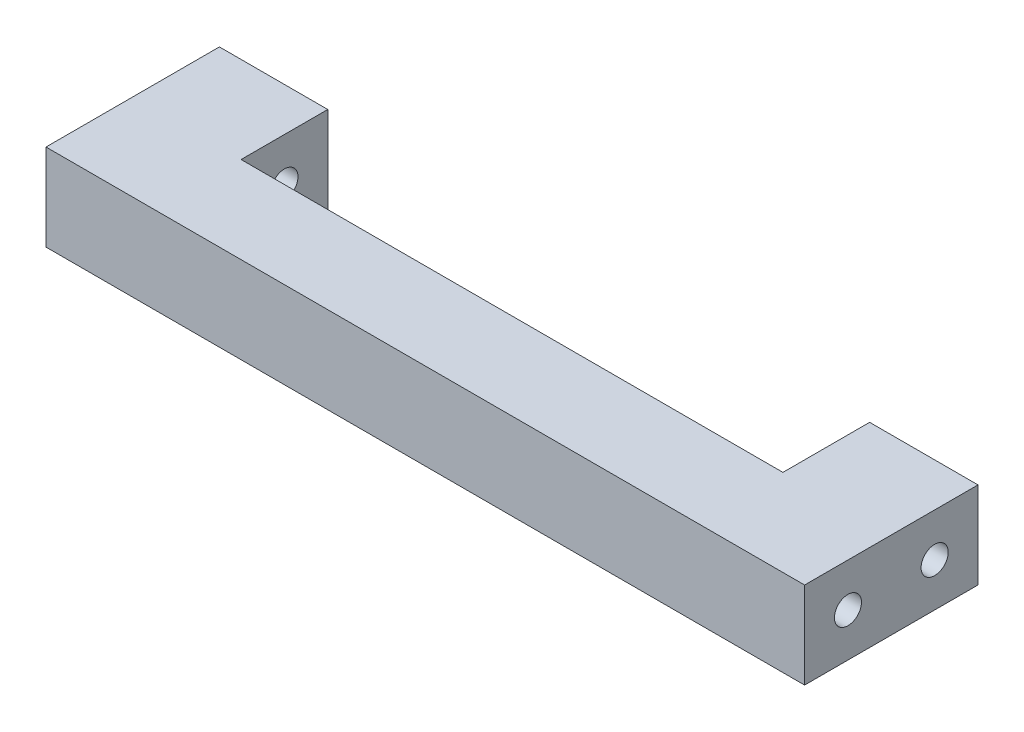
ISO-10303-21;
HEADER;
FILE_DESCRIPTION(('STEP AP214'),'2;1');
FILE_NAME('part.step','',(''),(''),'','','');
FILE_SCHEMA(('AUTOMOTIVE_DESIGN { 1 0 10303 214 1 1 1 1 }'));
ENDSEC;
DATA;
#1=APPLICATION_CONTEXT('core data for automotive mechanical design processes');
#2=APPLICATION_PROTOCOL_DEFINITION('international standard','automotive_design',2000,#1);
#3=PRODUCT_CONTEXT('',#1,'mechanical');
#4=PRODUCT('Part','Part','',(#3));
#5=PRODUCT_RELATED_PRODUCT_CATEGORY('part','',(#4));
#6=PRODUCT_DEFINITION_FORMATION('','',#4);
#7=PRODUCT_DEFINITION_CONTEXT('part definition',#1,'design');
#8=PRODUCT_DEFINITION('design','',#6,#7);
#9=PRODUCT_DEFINITION_SHAPE('','',#8);
#10=(LENGTH_UNIT() NAMED_UNIT(*) SI_UNIT(.MILLI.,.METRE.));
#11=(NAMED_UNIT(*) PLANE_ANGLE_UNIT() SI_UNIT($,.RADIAN.));
#12=(NAMED_UNIT(*) SI_UNIT($,.STERADIAN.) SOLID_ANGLE_UNIT());
#13=UNCERTAINTY_MEASURE_WITH_UNIT(LENGTH_MEASURE(1.E-05),#10,'distance_accuracy_value','');
#14=(GEOMETRIC_REPRESENTATION_CONTEXT(3) GLOBAL_UNCERTAINTY_ASSIGNED_CONTEXT((#13)) GLOBAL_UNIT_ASSIGNED_CONTEXT((#10,
#11,#12)) REPRESENTATION_CONTEXT('',''));
#15=CARTESIAN_POINT('',(0.,0.,0.));
#16=DIRECTION('',(0.,0.,1.));
#17=DIRECTION('',(1.,0.,0.));
#18=AXIS2_PLACEMENT_3D('',#15,#16,#17);
#19=CARTESIAN_POINT('',(35.,8.,-8.00000000000001));
#20=DIRECTION('',(0.,0.,1.));
#21=DIRECTION('',(1.,0.,0.));
#22=AXIS2_PLACEMENT_3D('',#19,#20,#21);
#23=PLANE('',#22);
#24=DIRECTION('',(-1.,0.,0.));
#25=VECTOR('',#24,1.);
#26=CARTESIAN_POINT('',(35.,8.,-8.00000000000001));
#27=LINE('',#26,#25);
#28=CARTESIAN_POINT('',(-25.,8.,-8.));
#29=VERTEX_POINT('',#28);
#30=CARTESIAN_POINT('',(-35.,8.,-8.));
#31=VERTEX_POINT('',#30);
#32=EDGE_CURVE('E65',#29,#31,#27,.T.);
#33=ORIENTED_EDGE('',*,*,#32,.F.);
#34=DIRECTION('',(0.,1.,0.));
#35=VECTOR('',#34,1.);
#36=CARTESIAN_POINT('',(-25.,0.,-8.));
#37=LINE('',#36,#35);
#38=CARTESIAN_POINT('',(-25.,0.,-8.));
#39=VERTEX_POINT('',#38);
#40=EDGE_CURVE('E152',#39,#29,#37,.T.);
#41=ORIENTED_EDGE('',*,*,#40,.F.);
#42=DIRECTION('',(-1.,0.,0.));
#43=VECTOR('',#42,1.);
#44=CARTESIAN_POINT('',(35.,0.,-8.00000000000001));
#45=LINE('',#44,#43);
#46=CARTESIAN_POINT('',(-35.,0.,-8.));
#47=VERTEX_POINT('',#46);
#48=EDGE_CURVE('E87',#39,#47,#45,.T.);
#49=ORIENTED_EDGE('',*,*,#48,.T.);
#50=DIRECTION('',(0.,-1.,0.));
#51=VECTOR('',#50,1.);
#52=CARTESIAN_POINT('',(-35.,8.,-8.));
#53=LINE('',#52,#51);
#54=EDGE_CURVE('E175',#31,#47,#53,.T.);
#55=ORIENTED_EDGE('',*,*,#54,.F.);
#56=EDGE_LOOP('',(#33,#41,#49,#55));
#57=FACE_BOUND('',#56,.T.);
#58=ADVANCED_FACE('F38',(#57),#23,.F.);
#59=CARTESIAN_POINT('',(-35.,8.,8.00000000000001));
#60=DIRECTION('',(1.,0.,0.));
#61=DIRECTION('',(0.,0.,-1.));
#62=AXIS2_PLACEMENT_3D('',#59,#60,#61);
#63=PLANE('',#62);
#64=CARTESIAN_POINT('',(-35.,4.,4.));
#65=DIRECTION('',(1.,0.,0.));
#66=DIRECTION('',(0.,0.,-1.));
#67=AXIS2_PLACEMENT_3D('',#64,#65,#66);
#68=CIRCLE('',#67,1.25);
#69=CARTESIAN_POINT('',(-35.,4.,2.75));
#70=VERTEX_POINT('',#69);
#71=EDGE_CURVE('E214',#70,#70,#68,.T.);
#72=ORIENTED_EDGE('',*,*,#71,.T.);
#73=EDGE_LOOP('',(#72));
#74=FACE_BOUND('',#73,.T.);
#75=CARTESIAN_POINT('',(-35.,4.,-4.));
#76=DIRECTION('',(1.,0.,0.));
#77=DIRECTION('',(0.,0.,-1.));
#78=AXIS2_PLACEMENT_3D('',#75,#76,#77);
#79=CIRCLE('',#78,1.25);
#80=CARTESIAN_POINT('',(-35.,4.,-5.25));
#81=VERTEX_POINT('',#80);
#82=EDGE_CURVE('E210',#81,#81,#79,.T.);
#83=ORIENTED_EDGE('',*,*,#82,.T.);
#84=EDGE_LOOP('',(#83));
#85=FACE_BOUND('',#84,.T.);
#86=DIRECTION('',(0.,0.,1.));
#87=VECTOR('',#86,1.);
#88=CARTESIAN_POINT('',(-35.,0.,8.00000000000001));
#89=LINE('',#88,#87);
#90=CARTESIAN_POINT('',(-35.,0.,8.00000000000001));
#91=VERTEX_POINT('',#90);
#92=EDGE_CURVE('E155',#47,#91,#89,.T.);
#93=ORIENTED_EDGE('',*,*,#92,.T.);
#94=DIRECTION('',(0.,-1.,0.));
#95=VECTOR('',#94,1.);
#96=CARTESIAN_POINT('',(-35.,8.,8.00000000000001));
#97=LINE('',#96,#95);
#98=CARTESIAN_POINT('',(-35.,8.,8.00000000000001));
#99=VERTEX_POINT('',#98);
#100=EDGE_CURVE('E11',#99,#91,#97,.T.);
#101=ORIENTED_EDGE('',*,*,#100,.F.);
#102=DIRECTION('',(0.,0.,1.));
#103=VECTOR('',#102,1.);
#104=CARTESIAN_POINT('',(-35.,8.,8.00000000000001));
#105=LINE('',#104,#103);
#106=EDGE_CURVE('E162',#31,#99,#105,.T.);
#107=ORIENTED_EDGE('',*,*,#106,.F.);
#108=ORIENTED_EDGE('',*,*,#54,.T.);
#109=EDGE_LOOP('',(#93,#101,#107,#108));
#110=FACE_BOUND('',#109,.T.);
#111=ADVANCED_FACE('F40',(#74,#85,#110),#63,.F.);
#112=CARTESIAN_POINT('',(35.,8.,7.99999999999999));
#113=DIRECTION('',(0.,0.,-1.));
#114=DIRECTION('',(-1.,0.,0.));
#115=AXIS2_PLACEMENT_3D('',#112,#113,#114);
#116=PLANE('',#115);
#117=DIRECTION('',(1.,0.,0.));
#118=VECTOR('',#117,1.);
#119=CARTESIAN_POINT('',(35.,0.,7.99999999999999));
#120=LINE('',#119,#118);
#121=CARTESIAN_POINT('',(35.,0.,7.99999999999999));
#122=VERTEX_POINT('',#121);
#123=EDGE_CURVE('E179',#91,#122,#120,.T.);
#124=ORIENTED_EDGE('',*,*,#123,.T.);
#125=DIRECTION('',(0.,-1.,0.));
#126=VECTOR('',#125,1.);
#127=CARTESIAN_POINT('',(35.,8.,7.99999999999999));
#128=LINE('',#127,#126);
#129=CARTESIAN_POINT('',(35.,8.,7.99999999999999));
#130=VERTEX_POINT('',#129);
#131=EDGE_CURVE('E48',#130,#122,#128,.T.);
#132=ORIENTED_EDGE('',*,*,#131,.F.);
#133=DIRECTION('',(1.,0.,0.));
#134=VECTOR('',#133,1.);
#135=CARTESIAN_POINT('',(35.,8.,7.99999999999999));
#136=LINE('',#135,#134);
#137=EDGE_CURVE('E94',#99,#130,#136,.T.);
#138=ORIENTED_EDGE('',*,*,#137,.F.);
#139=ORIENTED_EDGE('',*,*,#100,.T.);
#140=EDGE_LOOP('',(#124,#132,#138,#139));
#141=FACE_BOUND('',#140,.T.);
#142=ADVANCED_FACE('F238',(#141),#116,.F.);
#143=CARTESIAN_POINT('',(35.,8.,7.99999999999999));
#144=DIRECTION('',(-1.,0.,0.));
#145=DIRECTION('',(0.,0.,1.));
#146=AXIS2_PLACEMENT_3D('',#143,#144,#145);
#147=PLANE('',#146);
#148=CARTESIAN_POINT('',(35.,4.,4.));
#149=DIRECTION('',(1.,0.,0.));
#150=DIRECTION('',(0.,0.,-1.));
#151=AXIS2_PLACEMENT_3D('',#148,#149,#150);
#152=CIRCLE('',#151,1.25);
#153=CARTESIAN_POINT('',(35.,4.,2.75));
#154=VERTEX_POINT('',#153);
#155=EDGE_CURVE('E203',#154,#154,#152,.T.);
#156=ORIENTED_EDGE('',*,*,#155,.F.);
#157=EDGE_LOOP('',(#156));
#158=FACE_BOUND('',#157,.T.);
#159=CARTESIAN_POINT('',(35.,4.,-4.));
#160=DIRECTION('',(1.,0.,0.));
#161=DIRECTION('',(0.,0.,-1.));
#162=AXIS2_PLACEMENT_3D('',#159,#160,#161);
#163=CIRCLE('',#162,1.25);
#164=CARTESIAN_POINT('',(35.,4.,-5.25));
#165=VERTEX_POINT('',#164);
#166=EDGE_CURVE('E142',#165,#165,#163,.T.);
#167=ORIENTED_EDGE('',*,*,#166,.F.);
#168=EDGE_LOOP('',(#167));
#169=FACE_BOUND('',#168,.T.);
#170=DIRECTION('',(0.,0.,-1.));
#171=VECTOR('',#170,1.);
#172=CARTESIAN_POINT('',(35.,0.,7.99999999999999));
#173=LINE('',#172,#171);
#174=CARTESIAN_POINT('',(35.,0.,-8.00000000000001));
#175=VERTEX_POINT('',#174);
#176=EDGE_CURVE('E182',#122,#175,#173,.T.);
#177=ORIENTED_EDGE('',*,*,#176,.T.);
#178=DIRECTION('',(0.,-1.,0.));
#179=VECTOR('',#178,1.);
#180=CARTESIAN_POINT('',(35.,8.,-8.00000000000001));
#181=LINE('',#180,#179);
#182=CARTESIAN_POINT('',(35.,8.,-8.00000000000001));
#183=VERTEX_POINT('',#182);
#184=EDGE_CURVE('E190',#183,#175,#181,.T.);
#185=ORIENTED_EDGE('',*,*,#184,.F.);
#186=DIRECTION('',(0.,0.,-1.));
#187=VECTOR('',#186,1.);
#188=CARTESIAN_POINT('',(35.,8.,7.99999999999999));
#189=LINE('',#188,#187);
#190=EDGE_CURVE('E168',#130,#183,#189,.T.);
#191=ORIENTED_EDGE('',*,*,#190,.F.);
#192=ORIENTED_EDGE('',*,*,#131,.T.);
#193=EDGE_LOOP('',(#177,#185,#191,#192));
#194=FACE_BOUND('',#193,.T.);
#195=ADVANCED_FACE('F234',(#158,#169,#194),#147,.F.);
#196=CARTESIAN_POINT('',(25.,0.,-8.00000000000001));
#197=VERTEX_POINT('',#196);
#198=EDGE_CURVE('E165',#175,#197,#45,.T.);
#199=ORIENTED_EDGE('',*,*,#198,.T.);
#200=DIRECTION('',(0.,1.,0.));
#201=VECTOR('',#200,1.);
#202=CARTESIAN_POINT('',(25.,0.,-8.00000000000001));
#203=LINE('',#202,#201);
#204=CARTESIAN_POINT('',(25.,8.,-8.00000000000001));
#205=VERTEX_POINT('',#204);
#206=EDGE_CURVE('E156',#197,#205,#203,.T.);
#207=ORIENTED_EDGE('',*,*,#206,.T.);
#208=EDGE_CURVE('E171',#183,#205,#27,.T.);
#209=ORIENTED_EDGE('',*,*,#208,.F.);
#210=ORIENTED_EDGE('',*,*,#184,.T.);
#211=EDGE_LOOP('',(#199,#207,#209,#210));
#212=FACE_BOUND('',#211,.T.);
#213=ADVANCED_FACE('F237',(#212),#23,.F.);
#214=CARTESIAN_POINT('',(0.,8.,0.));
#215=DIRECTION('',(0.,1.,0.));
#216=DIRECTION('',(0.,0.,1.));
#217=AXIS2_PLACEMENT_3D('',#214,#215,#216);
#218=PLANE('',#217);
#219=DIRECTION('',(0.,0.,1.));
#220=VECTOR('',#219,1.);
#221=CARTESIAN_POINT('',(-25.,8.,-8.));
#222=LINE('',#221,#220);
#223=CARTESIAN_POINT('',(-25.,8.,0.));
#224=VERTEX_POINT('',#223);
#225=EDGE_CURVE('E120',#29,#224,#222,.T.);
#226=ORIENTED_EDGE('',*,*,#225,.F.);
#227=ORIENTED_EDGE('',*,*,#32,.T.);
#228=ORIENTED_EDGE('',*,*,#106,.T.);
#229=ORIENTED_EDGE('',*,*,#137,.T.);
#230=ORIENTED_EDGE('',*,*,#190,.T.);
#231=ORIENTED_EDGE('',*,*,#208,.T.);
#232=DIRECTION('',(0.,0.,-1.));
#233=VECTOR('',#232,1.);
#234=CARTESIAN_POINT('',(25.,8.,-8.00000000000001));
#235=LINE('',#234,#233);
#236=CARTESIAN_POINT('',(25.,8.,0.));
#237=VERTEX_POINT('',#236);
#238=EDGE_CURVE('E136',#237,#205,#235,.T.);
#239=ORIENTED_EDGE('',*,*,#238,.F.);
#240=DIRECTION('',(1.,0.,0.));
#241=VECTOR('',#240,1.);
#242=CARTESIAN_POINT('',(25.,8.,0.));
#243=LINE('',#242,#241);
#244=EDGE_CURVE('E139',#224,#237,#243,.T.);
#245=ORIENTED_EDGE('',*,*,#244,.F.);
#246=EDGE_LOOP('',(#226,#227,#228,#229,#230,#231,#239,#245));
#247=FACE_BOUND('',#246,.T.);
#248=ADVANCED_FACE('F248',(#247),#218,.T.);
#249=CARTESIAN_POINT('',(0.,0.,0.));
#250=DIRECTION('',(0.,1.,0.));
#251=DIRECTION('',(0.,0.,1.));
#252=AXIS2_PLACEMENT_3D('',#249,#250,#251);
#253=PLANE('',#252);
#254=ORIENTED_EDGE('',*,*,#48,.F.);
#255=DIRECTION('',(0.,0.,1.));
#256=VECTOR('',#255,1.);
#257=CARTESIAN_POINT('',(-25.,0.,-8.));
#258=LINE('',#257,#256);
#259=CARTESIAN_POINT('',(-25.,0.,0.));
#260=VERTEX_POINT('',#259);
#261=EDGE_CURVE('E119',#39,#260,#258,.T.);
#262=ORIENTED_EDGE('',*,*,#261,.T.);
#263=DIRECTION('',(1.,0.,0.));
#264=VECTOR('',#263,1.);
#265=CARTESIAN_POINT('',(25.,0.,0.));
#266=LINE('',#265,#264);
#267=CARTESIAN_POINT('',(25.,0.,0.));
#268=VERTEX_POINT('',#267);
#269=EDGE_CURVE('E128',#260,#268,#266,.T.);
#270=ORIENTED_EDGE('',*,*,#269,.T.);
#271=DIRECTION('',(0.,0.,-1.));
#272=VECTOR('',#271,1.);
#273=CARTESIAN_POINT('',(25.,0.,-8.00000000000001));
#274=LINE('',#273,#272);
#275=EDGE_CURVE('E56',#268,#197,#274,.T.);
#276=ORIENTED_EDGE('',*,*,#275,.T.);
#277=ORIENTED_EDGE('',*,*,#198,.F.);
#278=ORIENTED_EDGE('',*,*,#176,.F.);
#279=ORIENTED_EDGE('',*,*,#123,.F.);
#280=ORIENTED_EDGE('',*,*,#92,.F.);
#281=EDGE_LOOP('',(#254,#262,#270,#276,#277,#278,#279,#280));
#282=FACE_BOUND('',#281,.T.);
#283=ADVANCED_FACE('F133',(#282),#253,.F.);
#284=CARTESIAN_POINT('',(-25.,0.,-8.));
#285=DIRECTION('',(-1.,0.,0.));
#286=DIRECTION('',(0.,0.,1.));
#287=AXIS2_PLACEMENT_3D('',#284,#285,#286);
#288=PLANE('',#287);
#289=CARTESIAN_POINT('',(-25.,4.,-4.));
#290=DIRECTION('',(-1.,0.,0.));
#291=DIRECTION('',(0.,0.,1.));
#292=AXIS2_PLACEMENT_3D('',#289,#290,#291);
#293=CIRCLE('',#292,1.25);
#294=CARTESIAN_POINT('',(-25.,4.,-2.75));
#295=VERTEX_POINT('',#294);
#296=EDGE_CURVE('E42',#295,#295,#293,.F.);
#297=ORIENTED_EDGE('',*,*,#296,.F.);
#298=EDGE_LOOP('',(#297));
#299=FACE_BOUND('',#298,.T.);
#300=ORIENTED_EDGE('',*,*,#225,.T.);
#301=DIRECTION('',(0.,1.,0.));
#302=VECTOR('',#301,1.);
#303=CARTESIAN_POINT('',(-25.,0.,0.));
#304=LINE('',#303,#302);
#305=EDGE_CURVE('E115',#260,#224,#304,.T.);
#306=ORIENTED_EDGE('',*,*,#305,.F.);
#307=ORIENTED_EDGE('',*,*,#261,.F.);
#308=ORIENTED_EDGE('',*,*,#40,.T.);
#309=EDGE_LOOP('',(#300,#306,#307,#308));
#310=FACE_BOUND('',#309,.T.);
#311=ADVANCED_FACE('F117',(#299,#310),#288,.F.);
#312=CARTESIAN_POINT('',(25.,0.,-8.00000000000001));
#313=DIRECTION('',(1.,0.,0.));
#314=DIRECTION('',(0.,0.,-1.));
#315=AXIS2_PLACEMENT_3D('',#312,#313,#314);
#316=PLANE('',#315);
#317=CARTESIAN_POINT('',(25.,4.,-4.));
#318=DIRECTION('',(1.,0.,0.));
#319=DIRECTION('',(0.,0.,-1.));
#320=AXIS2_PLACEMENT_3D('',#317,#318,#319);
#321=CIRCLE('',#320,1.25);
#322=CARTESIAN_POINT('',(25.,4.,-5.25));
#323=VERTEX_POINT('',#322);
#324=EDGE_CURVE('E149',#323,#323,#321,.T.);
#325=ORIENTED_EDGE('',*,*,#324,.T.);
#326=EDGE_LOOP('',(#325));
#327=FACE_BOUND('',#326,.T.);
#328=ORIENTED_EDGE('',*,*,#238,.T.);
#329=ORIENTED_EDGE('',*,*,#206,.F.);
#330=ORIENTED_EDGE('',*,*,#275,.F.);
#331=DIRECTION('',(0.,1.,0.));
#332=VECTOR('',#331,1.);
#333=CARTESIAN_POINT('',(25.,0.,0.));
#334=LINE('',#333,#332);
#335=EDGE_CURVE('E125',#268,#237,#334,.T.);
#336=ORIENTED_EDGE('',*,*,#335,.T.);
#337=EDGE_LOOP('',(#328,#329,#330,#336));
#338=FACE_BOUND('',#337,.T.);
#339=ADVANCED_FACE('F274',(#327,#338),#316,.F.);
#340=CARTESIAN_POINT('',(25.,0.,0.));
#341=DIRECTION('',(0.,0.,1.));
#342=DIRECTION('',(1.,0.,0.));
#343=AXIS2_PLACEMENT_3D('',#340,#341,#342);
#344=PLANE('',#343);
#345=ORIENTED_EDGE('',*,*,#244,.T.);
#346=ORIENTED_EDGE('',*,*,#335,.F.);
#347=ORIENTED_EDGE('',*,*,#269,.F.);
#348=ORIENTED_EDGE('',*,*,#305,.T.);
#349=EDGE_LOOP('',(#345,#346,#347,#348));
#350=FACE_BOUND('',#349,.T.);
#351=ADVANCED_FACE('F129',(#350),#344,.F.);
#352=CARTESIAN_POINT('',(15.,4.,-4.));
#353=DIRECTION('',(1.,0.,0.));
#354=DIRECTION('',(0.,0.,-1.));
#355=AXIS2_PLACEMENT_3D('',#352,#353,#354);
#356=CYLINDRICAL_SURFACE('',#355,1.25);
#357=ORIENTED_EDGE('',*,*,#166,.T.);
#358=EDGE_LOOP('',(#357));
#359=FACE_BOUND('',#358,.T.);
#360=ORIENTED_EDGE('',*,*,#324,.F.);
#361=EDGE_LOOP('',(#360));
#362=FACE_BOUND('',#361,.T.);
#363=ADVANCED_FACE('F231',(#359,#362),#356,.F.);
#364=CARTESIAN_POINT('',(15.,4.,4.));
#365=DIRECTION('',(1.,0.,0.));
#366=DIRECTION('',(0.,0.,-1.));
#367=AXIS2_PLACEMENT_3D('',#364,#365,#366);
#368=CYLINDRICAL_SURFACE('',#367,1.25);
#369=CARTESIAN_POINT('',(15.,4.,4.));
#370=DIRECTION('',(1.,0.,0.));
#371=DIRECTION('',(0.,0.,-1.));
#372=AXIS2_PLACEMENT_3D('',#369,#370,#371);
#373=CIRCLE('',#372,1.25);
#374=CARTESIAN_POINT('',(15.,4.,2.75));
#375=VERTEX_POINT('',#374);
#376=EDGE_CURVE('E198',#375,#375,#373,.T.);
#377=ORIENTED_EDGE('',*,*,#376,.F.);
#378=EDGE_LOOP('',(#377));
#379=FACE_BOUND('',#378,.T.);
#380=ORIENTED_EDGE('',*,*,#155,.T.);
#381=EDGE_LOOP('',(#380));
#382=FACE_BOUND('',#381,.T.);
#383=ADVANCED_FACE('F282',(#379,#382),#368,.F.);
#384=CARTESIAN_POINT('',(15.,4.,4.));
#385=DIRECTION('',(1.,0.,0.));
#386=DIRECTION('',(0.,0.,-1.));
#387=AXIS2_PLACEMENT_3D('',#384,#385,#386);
#388=PLANE('',#387);
#389=ORIENTED_EDGE('',*,*,#376,.T.);
#390=EDGE_LOOP('',(#389));
#391=FACE_BOUND('',#390,.T.);
#392=ADVANCED_FACE('F285',(#391),#388,.T.);
#393=CARTESIAN_POINT('',(-15.,4.,-4.));
#394=DIRECTION('',(-1.,0.,0.));
#395=DIRECTION('',(0.,0.,1.));
#396=AXIS2_PLACEMENT_3D('',#393,#394,#395);
#397=CYLINDRICAL_SURFACE('',#396,1.25);
#398=ORIENTED_EDGE('',*,*,#82,.F.);
#399=EDGE_LOOP('',(#398));
#400=FACE_BOUND('',#399,.T.);
#401=ORIENTED_EDGE('',*,*,#296,.T.);
#402=EDGE_LOOP('',(#401));
#403=FACE_BOUND('',#402,.T.);
#404=ADVANCED_FACE('F289',(#400,#403),#397,.F.);
#405=CARTESIAN_POINT('',(-15.,4.,4.));
#406=DIRECTION('',(-1.,0.,0.));
#407=DIRECTION('',(0.,0.,1.));
#408=AXIS2_PLACEMENT_3D('',#405,#406,#407);
#409=CYLINDRICAL_SURFACE('',#408,1.25);
#410=CARTESIAN_POINT('',(-15.,4.,4.));
#411=DIRECTION('',(1.,0.,0.));
#412=DIRECTION('',(0.,0.,-1.));
#413=AXIS2_PLACEMENT_3D('',#410,#411,#412);
#414=CIRCLE('',#413,1.25);
#415=CARTESIAN_POINT('',(-15.,4.,2.75));
#416=VERTEX_POINT('',#415);
#417=EDGE_CURVE('E218',#416,#416,#414,.T.);
#418=ORIENTED_EDGE('',*,*,#417,.T.);
#419=EDGE_LOOP('',(#418));
#420=FACE_BOUND('',#419,.T.);
#421=ORIENTED_EDGE('',*,*,#71,.F.);
#422=EDGE_LOOP('',(#421));
#423=FACE_BOUND('',#422,.T.);
#424=ADVANCED_FACE('F292',(#420,#423),#409,.F.);
#425=CARTESIAN_POINT('',(-15.,4.,4.));
#426=DIRECTION('',(-1.,0.,0.));
#427=DIRECTION('',(0.,0.,-1.));
#428=AXIS2_PLACEMENT_3D('',#425,#426,#427);
#429=PLANE('',#428);
#430=ORIENTED_EDGE('',*,*,#417,.F.);
#431=EDGE_LOOP('',(#430));
#432=FACE_BOUND('',#431,.T.);
#433=ADVANCED_FACE('F296',(#432),#429,.T.);
#434=CLOSED_SHELL('',(#58,#111,#142,#195,#213,#248,#283,#311,#339,#351,#363,#383,#392,#404,#424,#433));
#435=MANIFOLD_SOLID_BREP('B2',#434);
#436=ADVANCED_BREP_SHAPE_REPRESENTATION('',(#18,#435),#14);
#437=SHAPE_DEFINITION_REPRESENTATION(#9,#436);
ENDSEC;
END-ISO-10303-21;
